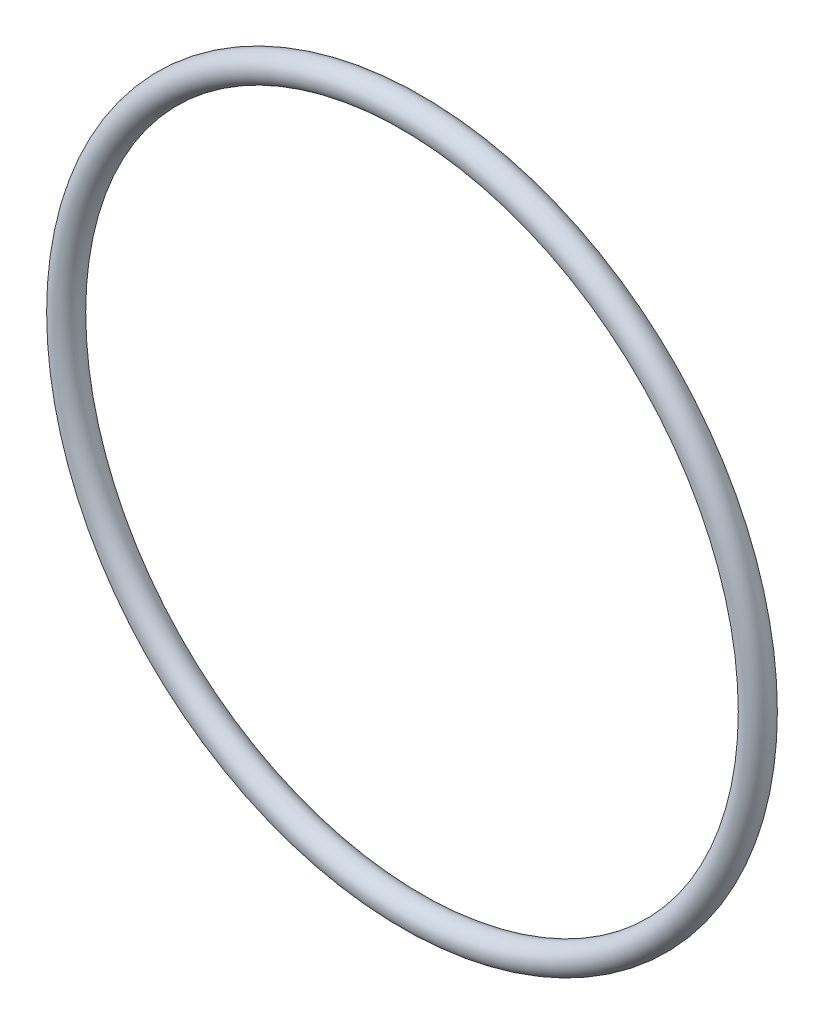
ISO-10303-21;
HEADER;
FILE_DESCRIPTION(('STEP AP214'),'2;1');
FILE_NAME('part.step','',(''),(''),'','','');
FILE_SCHEMA(('AUTOMOTIVE_DESIGN { 1 0 10303 214 1 1 1 1 }'));
ENDSEC;
DATA;
#1=APPLICATION_CONTEXT('core data for automotive mechanical design processes');
#2=APPLICATION_PROTOCOL_DEFINITION('international standard','automotive_design',2000,#1);
#3=PRODUCT_CONTEXT('',#1,'mechanical');
#4=PRODUCT('Part','Part','',(#3));
#5=PRODUCT_RELATED_PRODUCT_CATEGORY('part','',(#4));
#6=PRODUCT_DEFINITION_FORMATION('','',#4);
#7=PRODUCT_DEFINITION_CONTEXT('part definition',#1,'design');
#8=PRODUCT_DEFINITION('design','',#6,#7);
#9=PRODUCT_DEFINITION_SHAPE('','',#8);
#10=(LENGTH_UNIT() NAMED_UNIT(*) SI_UNIT(.MILLI.,.METRE.));
#11=(NAMED_UNIT(*) PLANE_ANGLE_UNIT() SI_UNIT($,.RADIAN.));
#12=(NAMED_UNIT(*) SI_UNIT($,.STERADIAN.) SOLID_ANGLE_UNIT());
#13=UNCERTAINTY_MEASURE_WITH_UNIT(LENGTH_MEASURE(1.E-05),#10,'distance_accuracy_value','');
#14=(GEOMETRIC_REPRESENTATION_CONTEXT(3) GLOBAL_UNCERTAINTY_ASSIGNED_CONTEXT((#13)) GLOBAL_UNIT_ASSIGNED_CONTEXT((#10,
#11,#12)) REPRESENTATION_CONTEXT('',''));
#15=CARTESIAN_POINT('',(0.,0.,0.));
#16=DIRECTION('',(0.,0.,1.));
#17=DIRECTION('',(1.,0.,0.));
#18=AXIS2_PLACEMENT_3D('',#15,#16,#17);
#19=CARTESIAN_POINT('',(0.,0.,0.));
#20=DIRECTION('',(0.,0.,-1.));
#21=DIRECTION('',(-1.,0.,0.));
#22=AXIS2_PLACEMENT_3D('',#19,#20,#21);
#23=TOROIDAL_SURFACE('',#22,12.5,0.500000000000001);
#24=CARTESIAN_POINT('',(-13.,0.,0.));
#25=VERTEX_POINT('',#24);
#26=VERTEX_LOOP('',#25);
#27=FACE_BOUND('',#26,.T.);
#28=ADVANCED_FACE('F33',(#27),#23,.T.);
#29=CLOSED_SHELL('',(#28));
#30=MANIFOLD_SOLID_BREP('B2',#29);
#31=ADVANCED_BREP_SHAPE_REPRESENTATION('',(#18,#30),#14);
#32=SHAPE_DEFINITION_REPRESENTATION(#9,#31);
ENDSEC;
END-ISO-10303-21;
